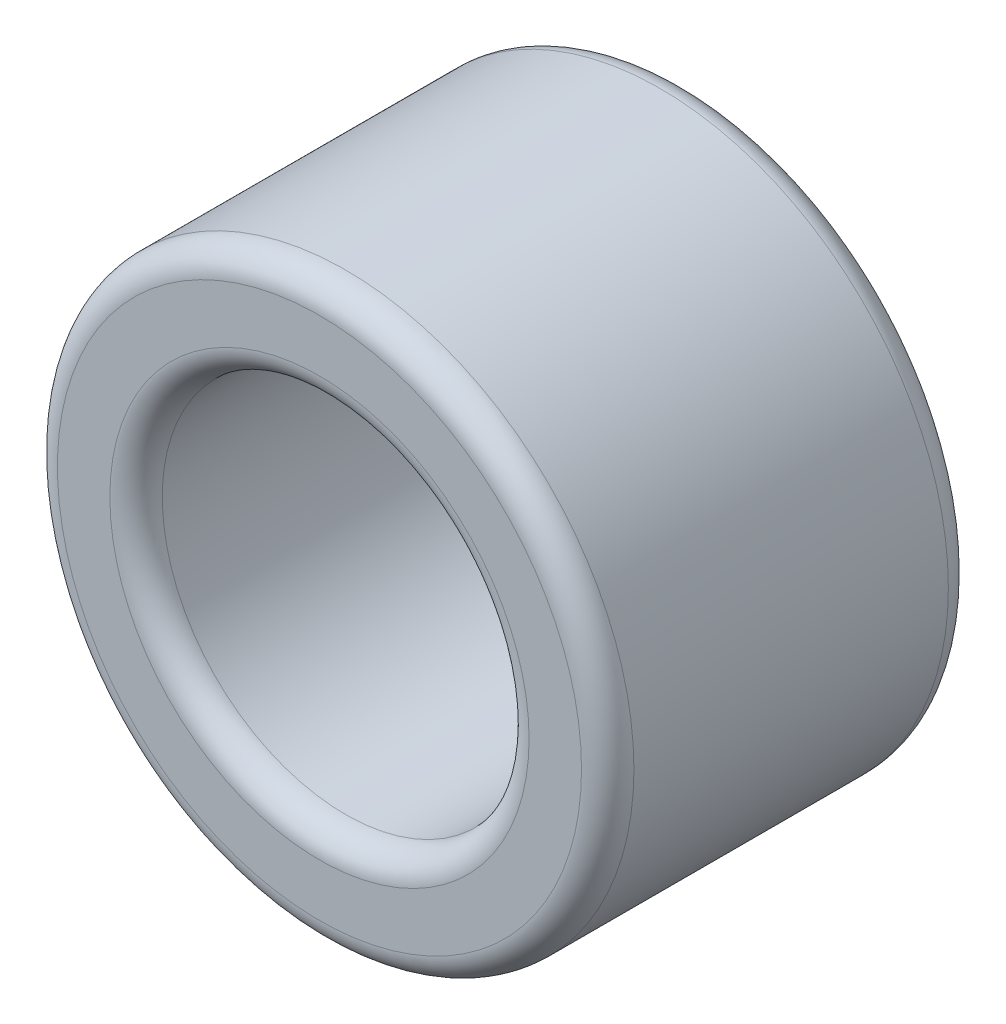
ISO-10303-21;
HEADER;
FILE_DESCRIPTION(('STEP AP214'),'2;1');
FILE_NAME('part.step','',(''),(''),'','','');
FILE_SCHEMA(('AUTOMOTIVE_DESIGN { 1 0 10303 214 1 1 1 1 }'));
ENDSEC;
DATA;
#1=APPLICATION_CONTEXT('core data for automotive mechanical design processes');
#2=APPLICATION_PROTOCOL_DEFINITION('international standard','automotive_design',2000,#1);
#3=PRODUCT_CONTEXT('',#1,'mechanical');
#4=PRODUCT('Part','Part','',(#3));
#5=PRODUCT_RELATED_PRODUCT_CATEGORY('part','',(#4));
#6=PRODUCT_DEFINITION_FORMATION('','',#4);
#7=PRODUCT_DEFINITION_CONTEXT('part definition',#1,'design');
#8=PRODUCT_DEFINITION('design','',#6,#7);
#9=PRODUCT_DEFINITION_SHAPE('','',#8);
#10=(LENGTH_UNIT() NAMED_UNIT(*) SI_UNIT(.MILLI.,.METRE.));
#11=(NAMED_UNIT(*) PLANE_ANGLE_UNIT() SI_UNIT($,.RADIAN.));
#12=(NAMED_UNIT(*) SI_UNIT($,.STERADIAN.) SOLID_ANGLE_UNIT());
#13=UNCERTAINTY_MEASURE_WITH_UNIT(LENGTH_MEASURE(1.E-05),#10,'distance_accuracy_value','');
#14=(GEOMETRIC_REPRESENTATION_CONTEXT(3) GLOBAL_UNCERTAINTY_ASSIGNED_CONTEXT((#13)) GLOBAL_UNIT_ASSIGNED_CONTEXT((#10,
#11,#12)) REPRESENTATION_CONTEXT('',''));
#15=CARTESIAN_POINT('',(0.,0.,0.));
#16=DIRECTION('',(0.,0.,1.));
#17=DIRECTION('',(1.,0.,0.));
#18=AXIS2_PLACEMENT_3D('',#15,#16,#17);
#19=CARTESIAN_POINT('',(0.,0.,355.6));
#20=DIRECTION('',(0.,0.,-1.));
#21=DIRECTION('',(-1.,0.,0.));
#22=AXIS2_PLACEMENT_3D('',#19,#20,#21);
#23=CYLINDRICAL_SURFACE('',#22,279.4);
#24=CARTESIAN_POINT('',(0.,0.,25.4));
#25=DIRECTION('',(0.,0.,1.));
#26=DIRECTION('',(1.,0.,0.));
#27=AXIS2_PLACEMENT_3D('',#24,#25,#26);
#28=CIRCLE('',#27,279.4);
#29=CARTESIAN_POINT('',(279.4,0.,25.4));
#30=VERTEX_POINT('',#29);
#31=EDGE_CURVE('E69',#30,#30,#28,.T.);
#32=ORIENTED_EDGE('',*,*,#31,.T.);
#33=EDGE_LOOP('',(#32));
#34=FACE_BOUND('',#33,.T.);
#35=CARTESIAN_POINT('',(0.,0.,330.2));
#36=DIRECTION('',(0.,0.,1.));
#37=DIRECTION('',(1.,0.,0.));
#38=AXIS2_PLACEMENT_3D('',#35,#36,#37);
#39=CIRCLE('',#38,279.4);
#40=CARTESIAN_POINT('',(279.4,0.,330.2));
#41=VERTEX_POINT('',#40);
#42=EDGE_CURVE('E73',#41,#41,#39,.F.);
#43=ORIENTED_EDGE('',*,*,#42,.T.);
#44=EDGE_LOOP('',(#43));
#45=FACE_BOUND('',#44,.T.);
#46=ADVANCED_FACE('F37',(#34,#45),#23,.T.);
#47=CARTESIAN_POINT('',(0.,0.,355.6));
#48=DIRECTION('',(0.,0.,1.));
#49=DIRECTION('',(1.,0.,0.));
#50=AXIS2_PLACEMENT_3D('',#47,#48,#49);
#51=PLANE('',#50);
#52=CARTESIAN_POINT('',(0.,0.,355.6));
#53=DIRECTION('',(0.,0.,1.));
#54=DIRECTION('',(1.,0.,0.));
#55=AXIS2_PLACEMENT_3D('',#52,#53,#54);
#56=CIRCLE('',#55,203.2);
#57=CARTESIAN_POINT('',(203.2,0.,355.6));
#58=VERTEX_POINT('',#57);
#59=EDGE_CURVE('E10',#58,#58,#56,.F.);
#60=ORIENTED_EDGE('',*,*,#59,.T.);
#61=EDGE_LOOP('',(#60));
#62=FACE_BOUND('',#61,.T.);
#63=CARTESIAN_POINT('',(0.,0.,355.6));
#64=DIRECTION('',(0.,0.,1.));
#65=DIRECTION('',(1.,0.,0.));
#66=AXIS2_PLACEMENT_3D('',#63,#64,#65);
#67=CIRCLE('',#66,254.);
#68=CARTESIAN_POINT('',(254.,0.,355.6));
#69=VERTEX_POINT('',#68);
#70=EDGE_CURVE('E61',#69,#69,#67,.T.);
#71=ORIENTED_EDGE('',*,*,#70,.T.);
#72=EDGE_LOOP('',(#71));
#73=FACE_BOUND('',#72,.T.);
#74=ADVANCED_FACE('F87',(#62,#73),#51,.T.);
#75=CARTESIAN_POINT('',(0.,0.,0.));
#76=DIRECTION('',(0.,0.,1.));
#77=DIRECTION('',(1.,0.,0.));
#78=AXIS2_PLACEMENT_3D('',#75,#76,#77);
#79=PLANE('',#78);
#80=CARTESIAN_POINT('',(0.,0.,0.));
#81=DIRECTION('',(0.,0.,1.));
#82=DIRECTION('',(1.,0.,0.));
#83=AXIS2_PLACEMENT_3D('',#80,#81,#82);
#84=CIRCLE('',#83,203.2);
#85=CARTESIAN_POINT('',(203.2,0.,0.));
#86=VERTEX_POINT('',#85);
#87=EDGE_CURVE('E55',#86,#86,#84,.T.);
#88=ORIENTED_EDGE('',*,*,#87,.T.);
#89=EDGE_LOOP('',(#88));
#90=FACE_BOUND('',#89,.T.);
#91=CARTESIAN_POINT('',(0.,0.,0.));
#92=DIRECTION('',(0.,0.,1.));
#93=DIRECTION('',(1.,0.,0.));
#94=AXIS2_PLACEMENT_3D('',#91,#92,#93);
#95=CIRCLE('',#94,254.);
#96=CARTESIAN_POINT('',(254.,0.,0.));
#97=VERTEX_POINT('',#96);
#98=EDGE_CURVE('E65',#97,#97,#95,.F.);
#99=ORIENTED_EDGE('',*,*,#98,.T.);
#100=EDGE_LOOP('',(#99));
#101=FACE_BOUND('',#100,.T.);
#102=ADVANCED_FACE('F89',(#90,#101),#79,.F.);
#103=CARTESIAN_POINT('',(0.,0.,0.));
#104=DIRECTION('',(0.,0.,1.));
#105=DIRECTION('',(1.,0.,0.));
#106=AXIS2_PLACEMENT_3D('',#103,#104,#105);
#107=CYLINDRICAL_SURFACE('',#106,177.8);
#108=CARTESIAN_POINT('',(0.,0.,25.4));
#109=DIRECTION('',(0.,0.,1.));
#110=DIRECTION('',(1.,0.,0.));
#111=AXIS2_PLACEMENT_3D('',#108,#109,#110);
#112=CIRCLE('',#111,177.8);
#113=CARTESIAN_POINT('',(177.8,0.,25.4));
#114=VERTEX_POINT('',#113);
#115=EDGE_CURVE('E45',#114,#114,#112,.F.);
#116=ORIENTED_EDGE('',*,*,#115,.T.);
#117=EDGE_LOOP('',(#116));
#118=FACE_BOUND('',#117,.T.);
#119=CARTESIAN_POINT('',(0.,0.,330.2));
#120=DIRECTION('',(0.,0.,1.));
#121=DIRECTION('',(1.,0.,0.));
#122=AXIS2_PLACEMENT_3D('',#119,#120,#121);
#123=CIRCLE('',#122,177.8);
#124=CARTESIAN_POINT('',(177.8,0.,330.2));
#125=VERTEX_POINT('',#124);
#126=EDGE_CURVE('E50',#125,#125,#123,.T.);
#127=ORIENTED_EDGE('',*,*,#126,.T.);
#128=EDGE_LOOP('',(#127));
#129=FACE_BOUND('',#128,.T.);
#130=ADVANCED_FACE('F95',(#118,#129),#107,.F.);
#131=CARTESIAN_POINT('',(0.,0.,25.4));
#132=DIRECTION('',(0.,0.,1.));
#133=DIRECTION('',(1.,0.,0.));
#134=AXIS2_PLACEMENT_3D('',#131,#132,#133);
#135=TOROIDAL_SURFACE('',#134,254.,25.4);
#136=ORIENTED_EDGE('',*,*,#98,.F.);
#137=EDGE_LOOP('',(#136));
#138=FACE_BOUND('',#137,.T.);
#139=ORIENTED_EDGE('',*,*,#31,.F.);
#140=EDGE_LOOP('',(#139));
#141=FACE_BOUND('',#140,.T.);
#142=ADVANCED_FACE('F83',(#138,#141),#135,.T.);
#143=CARTESIAN_POINT('',(0.,0.,330.2));
#144=DIRECTION('',(0.,0.,1.));
#145=DIRECTION('',(1.,0.,0.));
#146=AXIS2_PLACEMENT_3D('',#143,#144,#145);
#147=TOROIDAL_SURFACE('',#146,254.,25.4);
#148=ORIENTED_EDGE('',*,*,#42,.F.);
#149=EDGE_LOOP('',(#148));
#150=FACE_BOUND('',#149,.T.);
#151=ORIENTED_EDGE('',*,*,#70,.F.);
#152=EDGE_LOOP('',(#151));
#153=FACE_BOUND('',#152,.T.);
#154=ADVANCED_FACE('F79',(#150,#153),#147,.T.);
#155=CARTESIAN_POINT('',(0.,0.,25.4));
#156=DIRECTION('',(0.,0.,1.));
#157=DIRECTION('',(1.,0.,0.));
#158=AXIS2_PLACEMENT_3D('',#155,#156,#157);
#159=TOROIDAL_SURFACE('',#158,203.2,25.4);
#160=ORIENTED_EDGE('',*,*,#115,.F.);
#161=EDGE_LOOP('',(#160));
#162=FACE_BOUND('',#161,.T.);
#163=ORIENTED_EDGE('',*,*,#87,.F.);
#164=EDGE_LOOP('',(#163));
#165=FACE_BOUND('',#164,.T.);
#166=ADVANCED_FACE('F82',(#162,#165),#159,.T.);
#167=CARTESIAN_POINT('',(0.,0.,330.2));
#168=DIRECTION('',(0.,0.,1.));
#169=DIRECTION('',(1.,0.,0.));
#170=AXIS2_PLACEMENT_3D('',#167,#168,#169);
#171=TOROIDAL_SURFACE('',#170,203.2,25.4);
#172=ORIENTED_EDGE('',*,*,#59,.F.);
#173=EDGE_LOOP('',(#172));
#174=FACE_BOUND('',#173,.T.);
#175=ORIENTED_EDGE('',*,*,#126,.F.);
#176=EDGE_LOOP('',(#175));
#177=FACE_BOUND('',#176,.T.);
#178=ADVANCED_FACE('F39',(#174,#177),#171,.T.);
#179=CLOSED_SHELL('',(#46,#74,#102,#130,#142,#154,#166,#178));
#180=MANIFOLD_SOLID_BREP('B2',#179);
#181=ADVANCED_BREP_SHAPE_REPRESENTATION('',(#18,#180),#14);
#182=SHAPE_DEFINITION_REPRESENTATION(#9,#181);
ENDSEC;
END-ISO-10303-21;
